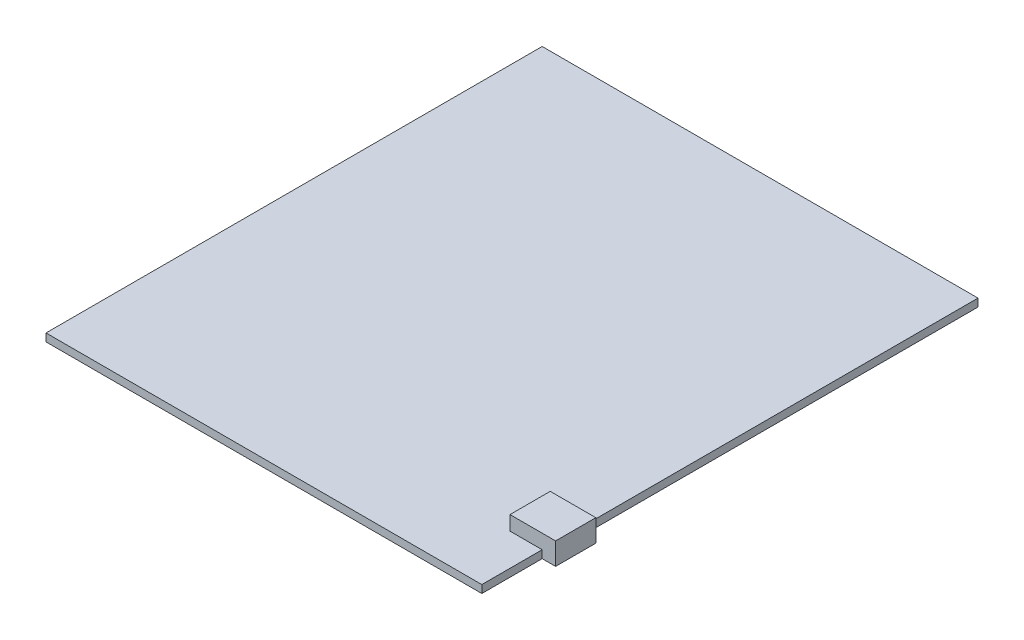
ISO-10303-21;
HEADER;
FILE_DESCRIPTION(('STEP AP214'),'2;1');
FILE_NAME('part.step','',(''),(''),'','','');
FILE_SCHEMA(('AUTOMOTIVE_DESIGN { 1 0 10303 214 1 1 1 1 }'));
ENDSEC;
DATA;
#1=APPLICATION_CONTEXT('core data for automotive mechanical design processes');
#2=APPLICATION_PROTOCOL_DEFINITION('international standard','automotive_design',2000,#1);
#3=PRODUCT_CONTEXT('',#1,'mechanical');
#4=PRODUCT('Part','Part','',(#3));
#5=PRODUCT_RELATED_PRODUCT_CATEGORY('part','',(#4));
#6=PRODUCT_DEFINITION_FORMATION('','',#4);
#7=PRODUCT_DEFINITION_CONTEXT('part definition',#1,'design');
#8=PRODUCT_DEFINITION('design','',#6,#7);
#9=PRODUCT_DEFINITION_SHAPE('','',#8);
#10=(LENGTH_UNIT() NAMED_UNIT(*) SI_UNIT(.MILLI.,.METRE.));
#11=(NAMED_UNIT(*) PLANE_ANGLE_UNIT() SI_UNIT($,.RADIAN.));
#12=(NAMED_UNIT(*) SI_UNIT($,.STERADIAN.) SOLID_ANGLE_UNIT());
#13=UNCERTAINTY_MEASURE_WITH_UNIT(LENGTH_MEASURE(1.E-05),#10,'distance_accuracy_value','');
#14=(GEOMETRIC_REPRESENTATION_CONTEXT(3) GLOBAL_UNCERTAINTY_ASSIGNED_CONTEXT((#13)) GLOBAL_UNIT_ASSIGNED_CONTEXT((#10,
#11,#12)) REPRESENTATION_CONTEXT('',''));
#15=CARTESIAN_POINT('',(0.,0.,0.));
#16=DIRECTION('',(0.,0.,1.));
#17=DIRECTION('',(1.,0.,0.));
#18=AXIS2_PLACEMENT_3D('',#15,#16,#17);
#19=CARTESIAN_POINT('',(41.275,1.4732,46.99));
#20=DIRECTION('',(-1.,0.,0.));
#21=DIRECTION('',(0.,0.,1.));
#22=AXIS2_PLACEMENT_3D('',#19,#20,#21);
#23=PLANE('',#22);
#24=DIRECTION('',(0.,1.,0.));
#25=VECTOR('',#24,1.);
#26=CARTESIAN_POINT('',(41.275,1.4732,27.94));
#27=LINE('',#26,#25);
#28=CARTESIAN_POINT('',(41.275,0.,27.94));
#29=VERTEX_POINT('',#28);
#30=CARTESIAN_POINT('',(41.275,1.4732,27.94));
#31=VERTEX_POINT('',#30);
#32=EDGE_CURVE('E147',#29,#31,#27,.T.);
#33=ORIENTED_EDGE('',*,*,#32,.F.);
#34=DIRECTION('',(0.,0.,-1.));
#35=VECTOR('',#34,1.);
#36=CARTESIAN_POINT('',(41.275,0.,46.99));
#37=LINE('',#36,#35);
#38=CARTESIAN_POINT('',(41.275,0.,-46.99));
#39=VERTEX_POINT('',#38);
#40=EDGE_CURVE('E150',#29,#39,#37,.T.);
#41=ORIENTED_EDGE('',*,*,#40,.T.);
#42=DIRECTION('',(0.,-1.,0.));
#43=VECTOR('',#42,1.);
#44=CARTESIAN_POINT('',(41.275,1.4732,-46.99));
#45=LINE('',#44,#43);
#46=CARTESIAN_POINT('',(41.275,1.4732,-46.99));
#47=VERTEX_POINT('',#46);
#48=EDGE_CURVE('E11',#47,#39,#45,.T.);
#49=ORIENTED_EDGE('',*,*,#48,.F.);
#50=DIRECTION('',(0.,0.,-1.));
#51=VECTOR('',#50,1.);
#52=CARTESIAN_POINT('',(41.275,1.4732,46.99));
#53=LINE('',#52,#51);
#54=EDGE_CURVE('E154',#31,#47,#53,.T.);
#55=ORIENTED_EDGE('',*,*,#54,.F.);
#56=EDGE_LOOP('',(#33,#41,#49,#55));
#57=FACE_BOUND('',#56,.T.);
#58=ADVANCED_FACE('F35',(#57),#23,.F.);
#59=DIRECTION('',(0.,-1.,0.));
#60=VECTOR('',#59,1.);
#61=CARTESIAN_POINT('',(41.275,1.4732,35.56));
#62=LINE('',#61,#60);
#63=CARTESIAN_POINT('',(41.275,1.4732,35.56));
#64=VERTEX_POINT('',#63);
#65=CARTESIAN_POINT('',(41.275,0.,35.56));
#66=VERTEX_POINT('',#65);
#67=EDGE_CURVE('E136',#64,#66,#62,.T.);
#68=ORIENTED_EDGE('',*,*,#67,.F.);
#69=CARTESIAN_POINT('',(41.275,1.4732,46.99));
#70=VERTEX_POINT('',#69);
#71=EDGE_CURVE('E151',#70,#64,#53,.T.);
#72=ORIENTED_EDGE('',*,*,#71,.F.);
#73=DIRECTION('',(0.,-1.,0.));
#74=VECTOR('',#73,1.);
#75=CARTESIAN_POINT('',(41.275,1.4732,46.99));
#76=LINE('',#75,#74);
#77=CARTESIAN_POINT('',(41.275,0.,46.99));
#78=VERTEX_POINT('',#77);
#79=EDGE_CURVE('E160',#70,#78,#76,.T.);
#80=ORIENTED_EDGE('',*,*,#79,.T.);
#81=EDGE_CURVE('E161',#78,#66,#37,.T.);
#82=ORIENTED_EDGE('',*,*,#81,.T.);
#83=EDGE_LOOP('',(#68,#72,#80,#82));
#84=FACE_BOUND('',#83,.T.);
#85=ADVANCED_FACE('F196',(#84),#23,.F.);
#86=CARTESIAN_POINT('',(0.,1.4732,0.));
#87=DIRECTION('',(0.,-1.,0.));
#88=DIRECTION('',(0.,0.,-1.));
#89=AXIS2_PLACEMENT_3D('',#86,#87,#88);
#90=PLANE('',#89);
#91=DIRECTION('',(-1.,0.,0.));
#92=VECTOR('',#91,1.);
#93=CARTESIAN_POINT('',(0.,1.4732,27.94));
#94=LINE('',#93,#92);
#95=CARTESIAN_POINT('',(35.179,1.4732,27.94));
#96=VERTEX_POINT('',#95);
#97=EDGE_CURVE('E145',#31,#96,#94,.T.);
#98=ORIENTED_EDGE('',*,*,#97,.F.);
#99=ORIENTED_EDGE('',*,*,#54,.T.);
#100=DIRECTION('',(-1.,0.,0.));
#101=VECTOR('',#100,1.);
#102=CARTESIAN_POINT('',(-41.275,1.4732,-46.99));
#103=LINE('',#102,#101);
#104=CARTESIAN_POINT('',(-41.275,1.4732,-46.99));
#105=VERTEX_POINT('',#104);
#106=EDGE_CURVE('E153',#47,#105,#103,.T.);
#107=ORIENTED_EDGE('',*,*,#106,.T.);
#108=DIRECTION('',(0.,0.,1.));
#109=VECTOR('',#108,1.);
#110=CARTESIAN_POINT('',(-41.275,1.4732,46.99));
#111=LINE('',#110,#109);
#112=CARTESIAN_POINT('',(-41.275,1.4732,46.99));
#113=VERTEX_POINT('',#112);
#114=EDGE_CURVE('E156',#105,#113,#111,.T.);
#115=ORIENTED_EDGE('',*,*,#114,.T.);
#116=DIRECTION('',(1.,0.,0.));
#117=VECTOR('',#116,1.);
#118=CARTESIAN_POINT('',(-41.275,1.4732,46.99));
#119=LINE('',#118,#117);
#120=EDGE_CURVE('E158',#113,#70,#119,.T.);
#121=ORIENTED_EDGE('',*,*,#120,.T.);
#122=ORIENTED_EDGE('',*,*,#71,.T.);
#123=DIRECTION('',(1.,0.,0.));
#124=VECTOR('',#123,1.);
#125=CARTESIAN_POINT('',(0.,1.4732,35.56));
#126=LINE('',#125,#124);
#127=CARTESIAN_POINT('',(35.179,1.4732,35.56));
#128=VERTEX_POINT('',#127);
#129=EDGE_CURVE('E54',#128,#64,#126,.T.);
#130=ORIENTED_EDGE('',*,*,#129,.F.);
#131=DIRECTION('',(0.,0.,1.));
#132=VECTOR('',#131,1.);
#133=CARTESIAN_POINT('',(35.179,1.4732,0.));
#134=LINE('',#133,#132);
#135=EDGE_CURVE('E49',#96,#128,#134,.T.);
#136=ORIENTED_EDGE('',*,*,#135,.F.);
#137=EDGE_LOOP('',(#98,#99,#107,#115,#121,#122,#130,#136));
#138=FACE_BOUND('',#137,.T.);
#139=ADVANCED_FACE('F197',(#138),#90,.F.);
#140=CARTESIAN_POINT('',(-41.275,1.4732,-46.99));
#141=DIRECTION('',(0.,0.,1.));
#142=DIRECTION('',(1.,0.,0.));
#143=AXIS2_PLACEMENT_3D('',#140,#141,#142);
#144=PLANE('',#143);
#145=DIRECTION('',(-1.,0.,0.));
#146=VECTOR('',#145,1.);
#147=CARTESIAN_POINT('',(-41.275,0.,-46.99));
#148=LINE('',#147,#146);
#149=CARTESIAN_POINT('',(-41.275,0.,-46.99));
#150=VERTEX_POINT('',#149);
#151=EDGE_CURVE('E163',#39,#150,#148,.T.);
#152=ORIENTED_EDGE('',*,*,#151,.T.);
#153=DIRECTION('',(0.,-1.,0.));
#154=VECTOR('',#153,1.);
#155=CARTESIAN_POINT('',(-41.275,1.4732,-46.99));
#156=LINE('',#155,#154);
#157=EDGE_CURVE('E42',#105,#150,#156,.T.);
#158=ORIENTED_EDGE('',*,*,#157,.F.);
#159=ORIENTED_EDGE('',*,*,#106,.F.);
#160=ORIENTED_EDGE('',*,*,#48,.T.);
#161=EDGE_LOOP('',(#152,#158,#159,#160));
#162=FACE_BOUND('',#161,.T.);
#163=ADVANCED_FACE('F200',(#162),#144,.F.);
#164=CARTESIAN_POINT('',(-41.275,1.4732,46.99));
#165=DIRECTION('',(1.,0.,0.));
#166=DIRECTION('',(0.,0.,-1.));
#167=AXIS2_PLACEMENT_3D('',#164,#165,#166);
#168=PLANE('',#167);
#169=DIRECTION('',(0.,0.,1.));
#170=VECTOR('',#169,1.);
#171=CARTESIAN_POINT('',(-41.275,0.,46.99));
#172=LINE('',#171,#170);
#173=CARTESIAN_POINT('',(-41.275,0.,46.99));
#174=VERTEX_POINT('',#173);
#175=EDGE_CURVE('E165',#150,#174,#172,.T.);
#176=ORIENTED_EDGE('',*,*,#175,.T.);
#177=DIRECTION('',(0.,-1.,0.));
#178=VECTOR('',#177,1.);
#179=CARTESIAN_POINT('',(-41.275,1.4732,46.99));
#180=LINE('',#179,#178);
#181=EDGE_CURVE('E171',#113,#174,#180,.T.);
#182=ORIENTED_EDGE('',*,*,#181,.F.);
#183=ORIENTED_EDGE('',*,*,#114,.F.);
#184=ORIENTED_EDGE('',*,*,#157,.T.);
#185=EDGE_LOOP('',(#176,#182,#183,#184));
#186=FACE_BOUND('',#185,.T.);
#187=ADVANCED_FACE('F178',(#186),#168,.F.);
#188=CARTESIAN_POINT('',(-41.275,1.4732,46.99));
#189=DIRECTION('',(0.,0.,-1.));
#190=DIRECTION('',(-1.,0.,0.));
#191=AXIS2_PLACEMENT_3D('',#188,#189,#190);
#192=PLANE('',#191);
#193=DIRECTION('',(1.,0.,0.));
#194=VECTOR('',#193,1.);
#195=CARTESIAN_POINT('',(-41.275,0.,46.99));
#196=LINE('',#195,#194);
#197=EDGE_CURVE('E167',#174,#78,#196,.T.);
#198=ORIENTED_EDGE('',*,*,#197,.T.);
#199=ORIENTED_EDGE('',*,*,#79,.F.);
#200=ORIENTED_EDGE('',*,*,#120,.F.);
#201=ORIENTED_EDGE('',*,*,#181,.T.);
#202=EDGE_LOOP('',(#198,#199,#200,#201));
#203=FACE_BOUND('',#202,.T.);
#204=ADVANCED_FACE('F191',(#203),#192,.F.);
#205=CARTESIAN_POINT('',(0.,0.,0.));
#206=DIRECTION('',(0.,-1.,0.));
#207=DIRECTION('',(0.,0.,-1.));
#208=AXIS2_PLACEMENT_3D('',#205,#206,#207);
#209=PLANE('',#208);
#210=CARTESIAN_POINT('',(31.75,0.,-38.1));
#211=DIRECTION('',(0.,-1.,0.));
#212=DIRECTION('',(0.,0.,-1.));
#213=AXIS2_PLACEMENT_3D('',#210,#211,#212);
#214=CIRCLE('',#213,4.7625);
#215=CARTESIAN_POINT('',(31.75,0.,-42.8625));
#216=VERTEX_POINT('',#215);
#217=EDGE_CURVE('E236',#216,#216,#214,.T.);
#218=ORIENTED_EDGE('',*,*,#217,.F.);
#219=EDGE_LOOP('',(#218));
#220=FACE_BOUND('',#219,.T.);
#221=CARTESIAN_POINT('',(-31.75,0.,-38.1));
#222=DIRECTION('',(0.,-1.,0.));
#223=DIRECTION('',(0.,0.,-1.));
#224=AXIS2_PLACEMENT_3D('',#221,#222,#223);
#225=CIRCLE('',#224,4.7625);
#226=CARTESIAN_POINT('',(-31.75,0.,-42.8625));
#227=VERTEX_POINT('',#226);
#228=EDGE_CURVE('E230',#227,#227,#225,.T.);
#229=ORIENTED_EDGE('',*,*,#228,.F.);
#230=EDGE_LOOP('',(#229));
#231=FACE_BOUND('',#230,.T.);
#232=CARTESIAN_POINT('',(31.75,0.,38.1));
#233=DIRECTION('',(0.,-1.,0.));
#234=DIRECTION('',(0.,0.,-1.));
#235=AXIS2_PLACEMENT_3D('',#232,#233,#234);
#236=CIRCLE('',#235,4.7625);
#237=CARTESIAN_POINT('',(31.75,0.,33.3375));
#238=VERTEX_POINT('',#237);
#239=EDGE_CURVE('E224',#238,#238,#236,.T.);
#240=ORIENTED_EDGE('',*,*,#239,.F.);
#241=EDGE_LOOP('',(#240));
#242=FACE_BOUND('',#241,.T.);
#243=CARTESIAN_POINT('',(-31.75,0.,38.1));
#244=DIRECTION('',(0.,-1.,0.));
#245=DIRECTION('',(0.,0.,-1.));
#246=AXIS2_PLACEMENT_3D('',#243,#244,#245);
#247=CIRCLE('',#246,4.7625);
#248=CARTESIAN_POINT('',(-31.75,0.,33.3375));
#249=VERTEX_POINT('',#248);
#250=EDGE_CURVE('E218',#249,#249,#247,.T.);
#251=ORIENTED_EDGE('',*,*,#250,.F.);
#252=EDGE_LOOP('',(#251));
#253=FACE_BOUND('',#252,.T.);
#254=ORIENTED_EDGE('',*,*,#40,.F.);
#255=DIRECTION('',(-1.,0.,0.));
#256=VECTOR('',#255,1.);
#257=CARTESIAN_POINT('',(35.179,0.,27.94));
#258=LINE('',#257,#256);
#259=CARTESIAN_POINT('',(43.815,0.,27.94));
#260=VERTEX_POINT('',#259);
#261=EDGE_CURVE('E202',#260,#29,#258,.T.);
#262=ORIENTED_EDGE('',*,*,#261,.F.);
#263=DIRECTION('',(0.,0.,-1.));
#264=VECTOR('',#263,1.);
#265=CARTESIAN_POINT('',(43.815,0.,35.56));
#266=LINE('',#265,#264);
#267=CARTESIAN_POINT('',(43.815,0.,35.56));
#268=VERTEX_POINT('',#267);
#269=EDGE_CURVE('E134',#268,#260,#266,.T.);
#270=ORIENTED_EDGE('',*,*,#269,.F.);
#271=DIRECTION('',(1.,0.,0.));
#272=VECTOR('',#271,1.);
#273=CARTESIAN_POINT('',(35.179,0.,35.56));
#274=LINE('',#273,#272);
#275=EDGE_CURVE('E130',#66,#268,#274,.T.);
#276=ORIENTED_EDGE('',*,*,#275,.F.);
#277=ORIENTED_EDGE('',*,*,#81,.F.);
#278=ORIENTED_EDGE('',*,*,#197,.F.);
#279=ORIENTED_EDGE('',*,*,#175,.F.);
#280=ORIENTED_EDGE('',*,*,#151,.F.);
#281=EDGE_LOOP('',(#254,#262,#270,#276,#277,#278,#279,#280));
#282=FACE_BOUND('',#281,.T.);
#283=ADVANCED_FACE('F186',(#220,#231,#242,#253,#282),#209,.T.);
#284=CARTESIAN_POINT('',(35.179,4.191,27.94));
#285=DIRECTION('',(0.,0.,1.));
#286=DIRECTION('',(1.,0.,0.));
#287=AXIS2_PLACEMENT_3D('',#284,#285,#286);
#288=PLANE('',#287);
#289=ORIENTED_EDGE('',*,*,#261,.T.);
#290=ORIENTED_EDGE('',*,*,#32,.T.);
#291=ORIENTED_EDGE('',*,*,#97,.T.);
#292=DIRECTION('',(0.,-1.,0.));
#293=VECTOR('',#292,1.);
#294=CARTESIAN_POINT('',(35.179,4.191,27.94));
#295=LINE('',#294,#293);
#296=CARTESIAN_POINT('',(35.179,4.191,27.94));
#297=VERTEX_POINT('',#296);
#298=EDGE_CURVE('E117',#297,#96,#295,.T.);
#299=ORIENTED_EDGE('',*,*,#298,.F.);
#300=DIRECTION('',(-1.,0.,0.));
#301=VECTOR('',#300,1.);
#302=CARTESIAN_POINT('',(35.179,4.191,27.94));
#303=LINE('',#302,#301);
#304=CARTESIAN_POINT('',(43.815,4.191,27.94));
#305=VERTEX_POINT('',#304);
#306=EDGE_CURVE('E109',#305,#297,#303,.T.);
#307=ORIENTED_EDGE('',*,*,#306,.F.);
#308=DIRECTION('',(0.,-1.,0.));
#309=VECTOR('',#308,1.);
#310=CARTESIAN_POINT('',(43.815,4.191,27.94));
#311=LINE('',#310,#309);
#312=EDGE_CURVE('E114',#305,#260,#311,.T.);
#313=ORIENTED_EDGE('',*,*,#312,.T.);
#314=EDGE_LOOP('',(#289,#290,#291,#299,#307,#313));
#315=FACE_BOUND('',#314,.T.);
#316=ADVANCED_FACE('F112',(#315),#288,.F.);
#317=CARTESIAN_POINT('',(35.179,4.191,35.56));
#318=DIRECTION('',(1.,0.,0.));
#319=DIRECTION('',(0.,0.,-1.));
#320=AXIS2_PLACEMENT_3D('',#317,#318,#319);
#321=PLANE('',#320);
#322=ORIENTED_EDGE('',*,*,#298,.T.);
#323=ORIENTED_EDGE('',*,*,#135,.T.);
#324=DIRECTION('',(0.,-1.,0.));
#325=VECTOR('',#324,1.);
#326=CARTESIAN_POINT('',(35.179,4.191,35.56));
#327=LINE('',#326,#325);
#328=CARTESIAN_POINT('',(35.179,4.191,35.56));
#329=VERTEX_POINT('',#328);
#330=EDGE_CURVE('E138',#329,#128,#327,.T.);
#331=ORIENTED_EDGE('',*,*,#330,.F.);
#332=DIRECTION('',(0.,0.,1.));
#333=VECTOR('',#332,1.);
#334=CARTESIAN_POINT('',(35.179,4.191,35.56));
#335=LINE('',#334,#333);
#336=EDGE_CURVE('E120',#297,#329,#335,.T.);
#337=ORIENTED_EDGE('',*,*,#336,.F.);
#338=EDGE_LOOP('',(#322,#323,#331,#337));
#339=FACE_BOUND('',#338,.T.);
#340=ADVANCED_FACE('F215',(#339),#321,.F.);
#341=CARTESIAN_POINT('',(35.179,4.191,35.56));
#342=DIRECTION('',(0.,0.,-1.));
#343=DIRECTION('',(-1.,0.,0.));
#344=AXIS2_PLACEMENT_3D('',#341,#342,#343);
#345=PLANE('',#344);
#346=ORIENTED_EDGE('',*,*,#129,.T.);
#347=ORIENTED_EDGE('',*,*,#67,.T.);
#348=ORIENTED_EDGE('',*,*,#275,.T.);
#349=DIRECTION('',(0.,-1.,0.));
#350=VECTOR('',#349,1.);
#351=CARTESIAN_POINT('',(43.815,4.191,35.56));
#352=LINE('',#351,#350);
#353=CARTESIAN_POINT('',(43.815,4.191,35.56));
#354=VERTEX_POINT('',#353);
#355=EDGE_CURVE('E209',#354,#268,#352,.T.);
#356=ORIENTED_EDGE('',*,*,#355,.F.);
#357=DIRECTION('',(1.,0.,0.));
#358=VECTOR('',#357,1.);
#359=CARTESIAN_POINT('',(35.179,4.191,35.56));
#360=LINE('',#359,#358);
#361=EDGE_CURVE('E126',#329,#354,#360,.T.);
#362=ORIENTED_EDGE('',*,*,#361,.F.);
#363=ORIENTED_EDGE('',*,*,#330,.T.);
#364=EDGE_LOOP('',(#346,#347,#348,#356,#362,#363));
#365=FACE_BOUND('',#364,.T.);
#366=ADVANCED_FACE('F213',(#365),#345,.F.);
#367=CARTESIAN_POINT('',(43.815,4.191,35.56));
#368=DIRECTION('',(-1.,0.,0.));
#369=DIRECTION('',(0.,0.,1.));
#370=AXIS2_PLACEMENT_3D('',#367,#368,#369);
#371=PLANE('',#370);
#372=ORIENTED_EDGE('',*,*,#269,.T.);
#373=ORIENTED_EDGE('',*,*,#312,.F.);
#374=DIRECTION('',(0.,0.,-1.));
#375=VECTOR('',#374,1.);
#376=CARTESIAN_POINT('',(43.815,4.191,35.56));
#377=LINE('',#376,#375);
#378=EDGE_CURVE('E121',#354,#305,#377,.T.);
#379=ORIENTED_EDGE('',*,*,#378,.F.);
#380=ORIENTED_EDGE('',*,*,#355,.T.);
#381=EDGE_LOOP('',(#372,#373,#379,#380));
#382=FACE_BOUND('',#381,.T.);
#383=ADVANCED_FACE('F132',(#382),#371,.F.);
#384=CARTESIAN_POINT('',(0.,4.191,0.));
#385=DIRECTION('',(0.,-1.,0.));
#386=DIRECTION('',(0.,0.,-1.));
#387=AXIS2_PLACEMENT_3D('',#384,#385,#386);
#388=PLANE('',#387);
#389=ORIENTED_EDGE('',*,*,#378,.T.);
#390=ORIENTED_EDGE('',*,*,#306,.T.);
#391=ORIENTED_EDGE('',*,*,#336,.T.);
#392=ORIENTED_EDGE('',*,*,#361,.T.);
#393=EDGE_LOOP('',(#389,#390,#391,#392));
#394=FACE_BOUND('',#393,.T.);
#395=ADVANCED_FACE('F124',(#394),#388,.F.);
#396=CARTESIAN_POINT('',(-31.75,-3.6068,38.1));
#397=DIRECTION('',(0.,1.,0.));
#398=DIRECTION('',(0.,0.,1.));
#399=AXIS2_PLACEMENT_3D('',#396,#397,#398);
#400=CYLINDRICAL_SURFACE('',#399,4.7625);
#401=CARTESIAN_POINT('',(-31.75,-3.6068,38.1));
#402=DIRECTION('',(0.,-1.,0.));
#403=DIRECTION('',(0.,0.,-1.));
#404=AXIS2_PLACEMENT_3D('',#401,#402,#403);
#405=CIRCLE('',#404,4.7625);
#406=CARTESIAN_POINT('',(-31.75,-3.6068,33.3375));
#407=VERTEX_POINT('',#406);
#408=EDGE_CURVE('E205',#407,#407,#405,.T.);
#409=ORIENTED_EDGE('',*,*,#408,.F.);
#410=EDGE_LOOP('',(#409));
#411=FACE_BOUND('',#410,.T.);
#412=ORIENTED_EDGE('',*,*,#250,.T.);
#413=EDGE_LOOP('',(#412));
#414=FACE_BOUND('',#413,.T.);
#415=ADVANCED_FACE('F260',(#411,#414),#400,.T.);
#416=CARTESIAN_POINT('',(-31.75,-3.6068,38.1));
#417=DIRECTION('',(0.,-1.,0.));
#418=DIRECTION('',(0.,0.,-1.));
#419=AXIS2_PLACEMENT_3D('',#416,#417,#418);
#420=PLANE('',#419);
#421=ORIENTED_EDGE('',*,*,#408,.T.);
#422=EDGE_LOOP('',(#421));
#423=FACE_BOUND('',#422,.T.);
#424=ADVANCED_FACE('F262',(#423),#420,.T.);
#425=CARTESIAN_POINT('',(31.75,-3.6068,38.1));
#426=DIRECTION('',(0.,1.,0.));
#427=DIRECTION('',(0.,0.,1.));
#428=AXIS2_PLACEMENT_3D('',#425,#426,#427);
#429=CYLINDRICAL_SURFACE('',#428,4.7625);
#430=CARTESIAN_POINT('',(31.75,-3.6068,38.1));
#431=DIRECTION('',(0.,-1.,0.));
#432=DIRECTION('',(0.,0.,-1.));
#433=AXIS2_PLACEMENT_3D('',#430,#431,#432);
#434=CIRCLE('',#433,4.7625);
#435=CARTESIAN_POINT('',(31.75,-3.6068,33.3375));
#436=VERTEX_POINT('',#435);
#437=EDGE_CURVE('E221',#436,#436,#434,.T.);
#438=ORIENTED_EDGE('',*,*,#437,.F.);
#439=EDGE_LOOP('',(#438));
#440=FACE_BOUND('',#439,.T.);
#441=ORIENTED_EDGE('',*,*,#239,.T.);
#442=EDGE_LOOP('',(#441));
#443=FACE_BOUND('',#442,.T.);
#444=ADVANCED_FACE('F269',(#440,#443),#429,.T.);
#445=CARTESIAN_POINT('',(31.75,-3.6068,38.1));
#446=DIRECTION('',(0.,-1.,0.));
#447=DIRECTION('',(0.,0.,-1.));
#448=AXIS2_PLACEMENT_3D('',#445,#446,#447);
#449=PLANE('',#448);
#450=ORIENTED_EDGE('',*,*,#437,.T.);
#451=EDGE_LOOP('',(#450));
#452=FACE_BOUND('',#451,.T.);
#453=ADVANCED_FACE('F365',(#452),#449,.T.);
#454=CARTESIAN_POINT('',(-31.75,-3.6068,-38.1));
#455=DIRECTION('',(0.,1.,0.));
#456=DIRECTION('',(0.,0.,1.));
#457=AXIS2_PLACEMENT_3D('',#454,#455,#456);
#458=CYLINDRICAL_SURFACE('',#457,4.7625);
#459=CARTESIAN_POINT('',(-31.75,-3.6068,-38.1));
#460=DIRECTION('',(0.,-1.,0.));
#461=DIRECTION('',(0.,0.,-1.));
#462=AXIS2_PLACEMENT_3D('',#459,#460,#461);
#463=CIRCLE('',#462,4.7625);
#464=CARTESIAN_POINT('',(-31.75,-3.6068,-42.8625));
#465=VERTEX_POINT('',#464);
#466=EDGE_CURVE('E227',#465,#465,#463,.T.);
#467=ORIENTED_EDGE('',*,*,#466,.F.);
#468=EDGE_LOOP('',(#467));
#469=FACE_BOUND('',#468,.T.);
#470=ORIENTED_EDGE('',*,*,#228,.T.);
#471=EDGE_LOOP('',(#470));
#472=FACE_BOUND('',#471,.T.);
#473=ADVANCED_FACE('F376',(#469,#472),#458,.T.);
#474=CARTESIAN_POINT('',(-31.75,-3.6068,-38.1));
#475=DIRECTION('',(0.,-1.,0.));
#476=DIRECTION('',(0.,0.,-1.));
#477=AXIS2_PLACEMENT_3D('',#474,#475,#476);
#478=PLANE('',#477);
#479=ORIENTED_EDGE('',*,*,#466,.T.);
#480=EDGE_LOOP('',(#479));
#481=FACE_BOUND('',#480,.T.);
#482=ADVANCED_FACE('F247',(#481),#478,.T.);
#483=CARTESIAN_POINT('',(31.75,-3.6068,-38.1));
#484=DIRECTION('',(0.,1.,0.));
#485=DIRECTION('',(0.,0.,1.));
#486=AXIS2_PLACEMENT_3D('',#483,#484,#485);
#487=CYLINDRICAL_SURFACE('',#486,4.7625);
#488=CARTESIAN_POINT('',(31.75,-3.6068,-38.1));
#489=DIRECTION('',(0.,-1.,0.));
#490=DIRECTION('',(0.,0.,-1.));
#491=AXIS2_PLACEMENT_3D('',#488,#489,#490);
#492=CIRCLE('',#491,4.7625);
#493=CARTESIAN_POINT('',(31.75,-3.6068,-42.8625));
#494=VERTEX_POINT('',#493);
#495=EDGE_CURVE('E233',#494,#494,#492,.T.);
#496=ORIENTED_EDGE('',*,*,#495,.F.);
#497=EDGE_LOOP('',(#496));
#498=FACE_BOUND('',#497,.T.);
#499=ORIENTED_EDGE('',*,*,#217,.T.);
#500=EDGE_LOOP('',(#499));
#501=FACE_BOUND('',#500,.T.);
#502=ADVANCED_FACE('F244',(#498,#501),#487,.T.);
#503=CARTESIAN_POINT('',(31.75,-3.6068,-38.1));
#504=DIRECTION('',(0.,-1.,0.));
#505=DIRECTION('',(0.,0.,-1.));
#506=AXIS2_PLACEMENT_3D('',#503,#504,#505);
#507=PLANE('',#506);
#508=ORIENTED_EDGE('',*,*,#495,.T.);
#509=EDGE_LOOP('',(#508));
#510=FACE_BOUND('',#509,.T.);
#511=ADVANCED_FACE('F242',(#510),#507,.T.);
#512=CLOSED_SHELL('',(#58,#85,#139,#163,#187,#204,#283,#316,#340,#366,#383,#395,#415,#424,#444,
#453,#473,#482,#502,#511));
#513=MANIFOLD_SOLID_BREP('B2',#512);
#514=ADVANCED_BREP_SHAPE_REPRESENTATION('',(#18,#513),#14);
#515=SHAPE_DEFINITION_REPRESENTATION(#9,#514);
ENDSEC;
END-ISO-10303-21;
